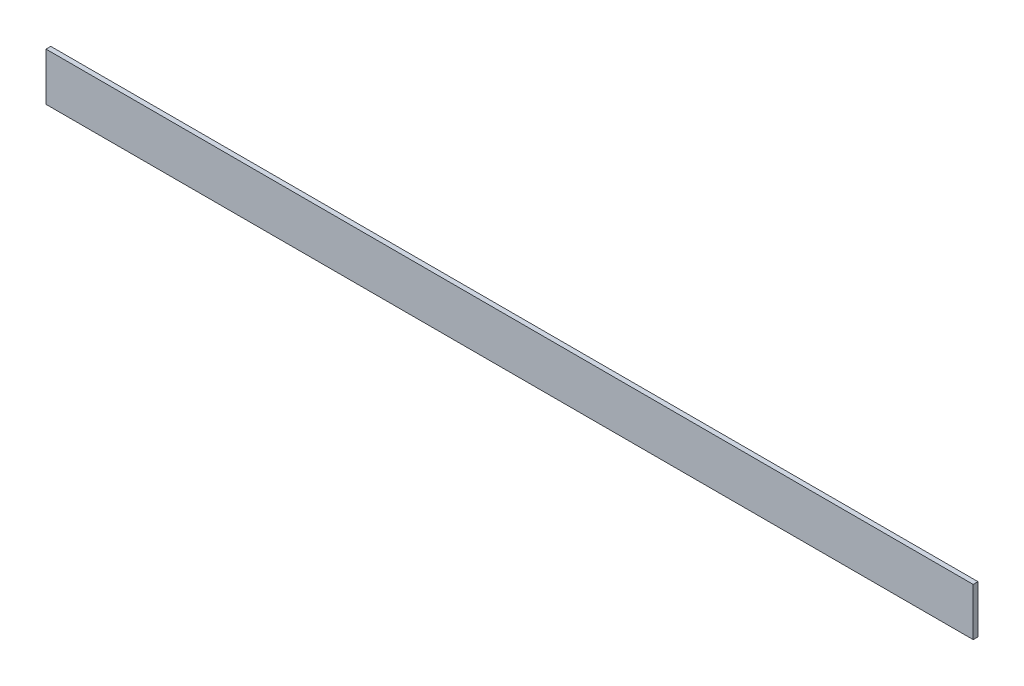
ISO-10303-21;
HEADER;
FILE_DESCRIPTION(('STEP AP214'),'2;1');
FILE_NAME('part.step','',(''),(''),'','','');
FILE_SCHEMA(('AUTOMOTIVE_DESIGN { 1 0 10303 214 1 1 1 1 }'));
ENDSEC;
DATA;
#1=APPLICATION_CONTEXT('core data for automotive mechanical design processes');
#2=APPLICATION_PROTOCOL_DEFINITION('international standard','automotive_design',2000,#1);
#3=PRODUCT_CONTEXT('',#1,'mechanical');
#4=PRODUCT('Part','Part','',(#3));
#5=PRODUCT_RELATED_PRODUCT_CATEGORY('part','',(#4));
#6=PRODUCT_DEFINITION_FORMATION('','',#4);
#7=PRODUCT_DEFINITION_CONTEXT('part definition',#1,'design');
#8=PRODUCT_DEFINITION('design','',#6,#7);
#9=PRODUCT_DEFINITION_SHAPE('','',#8);
#10=(LENGTH_UNIT() NAMED_UNIT(*) SI_UNIT(.MILLI.,.METRE.));
#11=(NAMED_UNIT(*) PLANE_ANGLE_UNIT() SI_UNIT($,.RADIAN.));
#12=(NAMED_UNIT(*) SI_UNIT($,.STERADIAN.) SOLID_ANGLE_UNIT());
#13=UNCERTAINTY_MEASURE_WITH_UNIT(LENGTH_MEASURE(1.E-05),#10,'distance_accuracy_value','');
#14=(GEOMETRIC_REPRESENTATION_CONTEXT(3) GLOBAL_UNCERTAINTY_ASSIGNED_CONTEXT((#13)) GLOBAL_UNIT_ASSIGNED_CONTEXT((#10,
#11,#12)) REPRESENTATION_CONTEXT('',''));
#15=CARTESIAN_POINT('',(0.,0.,0.));
#16=DIRECTION('',(0.,0.,1.));
#17=DIRECTION('',(1.,0.,0.));
#18=AXIS2_PLACEMENT_3D('',#15,#16,#17);
#19=CARTESIAN_POINT('',(-969.,50.,10.));
#20=DIRECTION('',(1.,0.,0.));
#21=DIRECTION('',(0.,0.,-1.));
#22=AXIS2_PLACEMENT_3D('',#19,#20,#21);
#23=PLANE('',#22);
#24=DIRECTION('',(0.,-1.,0.));
#25=VECTOR('',#24,1.);
#26=CARTESIAN_POINT('',(-969.,50.,0.));
#27=LINE('',#26,#25);
#28=CARTESIAN_POINT('',(-969.,50.,0.));
#29=VERTEX_POINT('',#28);
#30=CARTESIAN_POINT('',(-969.,-50.,0.));
#31=VERTEX_POINT('',#30);
#32=EDGE_CURVE('E102',#29,#31,#27,.T.);
#33=ORIENTED_EDGE('',*,*,#32,.T.);
#34=DIRECTION('',(0.,0.,-1.));
#35=VECTOR('',#34,1.);
#36=CARTESIAN_POINT('',(-969.,-50.,10.));
#37=LINE('',#36,#35);
#38=CARTESIAN_POINT('',(-969.,-50.,10.));
#39=VERTEX_POINT('',#38);
#40=EDGE_CURVE('E11',#39,#31,#37,.T.);
#41=ORIENTED_EDGE('',*,*,#40,.F.);
#42=DIRECTION('',(0.,-1.,0.));
#43=VECTOR('',#42,1.);
#44=CARTESIAN_POINT('',(-969.,50.,10.));
#45=LINE('',#44,#43);
#46=CARTESIAN_POINT('',(-969.,50.,10.));
#47=VERTEX_POINT('',#46);
#48=EDGE_CURVE('E90',#47,#39,#45,.T.);
#49=ORIENTED_EDGE('',*,*,#48,.F.);
#50=DIRECTION('',(0.,0.,-1.));
#51=VECTOR('',#50,1.);
#52=CARTESIAN_POINT('',(-969.,50.,10.));
#53=LINE('',#52,#51);
#54=EDGE_CURVE('E98',#47,#29,#53,.T.);
#55=ORIENTED_EDGE('',*,*,#54,.T.);
#56=EDGE_LOOP('',(#33,#41,#49,#55));
#57=FACE_BOUND('',#56,.T.);
#58=ADVANCED_FACE('F39',(#57),#23,.F.);
#59=CARTESIAN_POINT('',(-969.,-50.,10.));
#60=DIRECTION('',(0.,1.,0.));
#61=DIRECTION('',(0.,0.,1.));
#62=AXIS2_PLACEMENT_3D('',#59,#60,#61);
#63=PLANE('',#62);
#64=DIRECTION('',(1.,0.,0.));
#65=VECTOR('',#64,1.);
#66=CARTESIAN_POINT('',(-969.,-50.,0.));
#67=LINE('',#66,#65);
#68=CARTESIAN_POINT('',(969.,-50.,0.));
#69=VERTEX_POINT('',#68);
#70=EDGE_CURVE('E94',#31,#69,#67,.T.);
#71=ORIENTED_EDGE('',*,*,#70,.T.);
#72=DIRECTION('',(0.,0.,-1.));
#73=VECTOR('',#72,1.);
#74=CARTESIAN_POINT('',(969.,-50.,10.));
#75=LINE('',#74,#73);
#76=CARTESIAN_POINT('',(969.,-50.,10.));
#77=VERTEX_POINT('',#76);
#78=EDGE_CURVE('E47',#77,#69,#75,.T.);
#79=ORIENTED_EDGE('',*,*,#78,.F.);
#80=DIRECTION('',(1.,0.,0.));
#81=VECTOR('',#80,1.);
#82=CARTESIAN_POINT('',(-969.,-50.,10.));
#83=LINE('',#82,#81);
#84=EDGE_CURVE('E85',#39,#77,#83,.T.);
#85=ORIENTED_EDGE('',*,*,#84,.F.);
#86=ORIENTED_EDGE('',*,*,#40,.T.);
#87=EDGE_LOOP('',(#71,#79,#85,#86));
#88=FACE_BOUND('',#87,.T.);
#89=ADVANCED_FACE('F93',(#88),#63,.F.);
#90=CARTESIAN_POINT('',(969.,50.,10.));
#91=DIRECTION('',(-1.,0.,0.));
#92=DIRECTION('',(0.,0.,1.));
#93=AXIS2_PLACEMENT_3D('',#90,#91,#92);
#94=PLANE('',#93);
#95=DIRECTION('',(0.,1.,0.));
#96=VECTOR('',#95,1.);
#97=CARTESIAN_POINT('',(969.,50.,0.));
#98=LINE('',#97,#96);
#99=CARTESIAN_POINT('',(969.,50.,0.));
#100=VERTEX_POINT('',#99);
#101=EDGE_CURVE('E72',#69,#100,#98,.T.);
#102=ORIENTED_EDGE('',*,*,#101,.T.);
#103=DIRECTION('',(0.,0.,-1.));
#104=VECTOR('',#103,1.);
#105=CARTESIAN_POINT('',(969.,50.,10.));
#106=LINE('',#105,#104);
#107=CARTESIAN_POINT('',(969.,50.,10.));
#108=VERTEX_POINT('',#107);
#109=EDGE_CURVE('E95',#108,#100,#106,.T.);
#110=ORIENTED_EDGE('',*,*,#109,.F.);
#111=DIRECTION('',(0.,1.,0.));
#112=VECTOR('',#111,1.);
#113=CARTESIAN_POINT('',(969.,50.,10.));
#114=LINE('',#113,#112);
#115=EDGE_CURVE('E88',#77,#108,#114,.T.);
#116=ORIENTED_EDGE('',*,*,#115,.F.);
#117=ORIENTED_EDGE('',*,*,#78,.T.);
#118=EDGE_LOOP('',(#102,#110,#116,#117));
#119=FACE_BOUND('',#118,.T.);
#120=ADVANCED_FACE('F96',(#119),#94,.F.);
#121=CARTESIAN_POINT('',(-969.,50.,10.));
#122=DIRECTION('',(0.,-1.,0.));
#123=DIRECTION('',(1.,0.,0.));
#124=AXIS2_PLACEMENT_3D('',#121,#122,#123);
#125=PLANE('',#124);
#126=DIRECTION('',(-1.,0.,0.));
#127=VECTOR('',#126,1.);
#128=CARTESIAN_POINT('',(-969.,50.,0.));
#129=LINE('',#128,#127);
#130=EDGE_CURVE('E78',#100,#29,#129,.T.);
#131=ORIENTED_EDGE('',*,*,#130,.T.);
#132=ORIENTED_EDGE('',*,*,#54,.F.);
#133=DIRECTION('',(-1.,0.,0.));
#134=VECTOR('',#133,1.);
#135=CARTESIAN_POINT('',(-969.,50.,10.));
#136=LINE('',#135,#134);
#137=EDGE_CURVE('E55',#108,#47,#136,.T.);
#138=ORIENTED_EDGE('',*,*,#137,.F.);
#139=ORIENTED_EDGE('',*,*,#109,.T.);
#140=EDGE_LOOP('',(#131,#132,#138,#139));
#141=FACE_BOUND('',#140,.T.);
#142=ADVANCED_FACE('F109',(#141),#125,.F.);
#143=CARTESIAN_POINT('',(0.,0.,10.));
#144=DIRECTION('',(0.,0.,1.));
#145=DIRECTION('',(1.,0.,0.));
#146=AXIS2_PLACEMENT_3D('',#143,#144,#145);
#147=PLANE('',#146);
#148=ORIENTED_EDGE('',*,*,#48,.T.);
#149=ORIENTED_EDGE('',*,*,#84,.T.);
#150=ORIENTED_EDGE('',*,*,#115,.T.);
#151=ORIENTED_EDGE('',*,*,#137,.T.);
#152=EDGE_LOOP('',(#148,#149,#150,#151));
#153=FACE_BOUND('',#152,.T.);
#154=ADVANCED_FACE('F86',(#153),#147,.T.);
#155=CARTESIAN_POINT('',(0.,0.,0.));
#156=DIRECTION('',(0.,0.,1.));
#157=DIRECTION('',(1.,0.,0.));
#158=AXIS2_PLACEMENT_3D('',#155,#156,#157);
#159=PLANE('',#158);
#160=ORIENTED_EDGE('',*,*,#32,.F.);
#161=ORIENTED_EDGE('',*,*,#130,.F.);
#162=ORIENTED_EDGE('',*,*,#101,.F.);
#163=ORIENTED_EDGE('',*,*,#70,.F.);
#164=EDGE_LOOP('',(#160,#161,#162,#163));
#165=FACE_BOUND('',#164,.T.);
#166=ADVANCED_FACE('F112',(#165),#159,.F.);
#167=CLOSED_SHELL('',(#58,#89,#120,#142,#154,#166));
#168=MANIFOLD_SOLID_BREP('B2',#167);
#169=ADVANCED_BREP_SHAPE_REPRESENTATION('',(#18,#168),#14);
#170=SHAPE_DEFINITION_REPRESENTATION(#9,#169);
ENDSEC;
END-ISO-10303-21;
